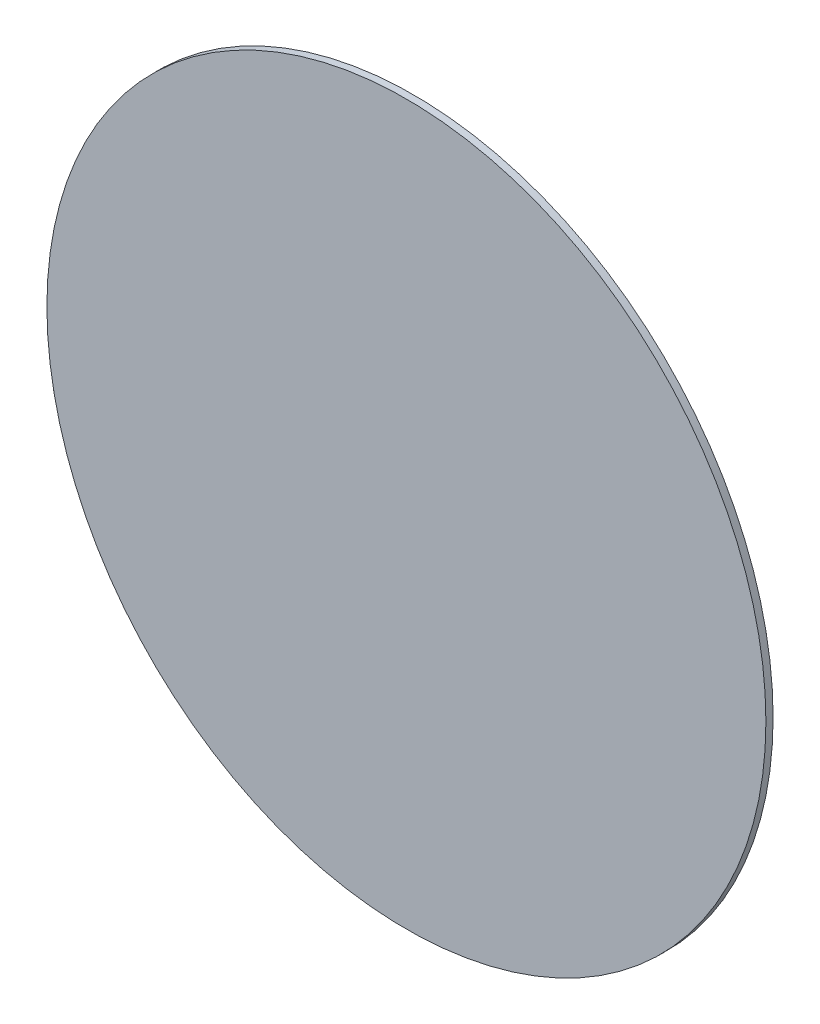
ISO-10303-21;
HEADER;
FILE_DESCRIPTION(('STEP AP214'),'2;1');
FILE_NAME('part.step','',(''),(''),'','','');
FILE_SCHEMA(('AUTOMOTIVE_DESIGN { 1 0 10303 214 1 1 1 1 }'));
ENDSEC;
DATA;
#1=APPLICATION_CONTEXT('core data for automotive mechanical design processes');
#2=APPLICATION_PROTOCOL_DEFINITION('international standard','automotive_design',2000,#1);
#3=PRODUCT_CONTEXT('',#1,'mechanical');
#4=PRODUCT('Part','Part','',(#3));
#5=PRODUCT_RELATED_PRODUCT_CATEGORY('part','',(#4));
#6=PRODUCT_DEFINITION_FORMATION('','',#4);
#7=PRODUCT_DEFINITION_CONTEXT('part definition',#1,'design');
#8=PRODUCT_DEFINITION('design','',#6,#7);
#9=PRODUCT_DEFINITION_SHAPE('','',#8);
#10=(LENGTH_UNIT() NAMED_UNIT(*) SI_UNIT(.MILLI.,.METRE.));
#11=(NAMED_UNIT(*) PLANE_ANGLE_UNIT() SI_UNIT($,.RADIAN.));
#12=(NAMED_UNIT(*) SI_UNIT($,.STERADIAN.) SOLID_ANGLE_UNIT());
#13=UNCERTAINTY_MEASURE_WITH_UNIT(LENGTH_MEASURE(1.E-05),#10,'distance_accuracy_value','');
#14=(GEOMETRIC_REPRESENTATION_CONTEXT(3) GLOBAL_UNCERTAINTY_ASSIGNED_CONTEXT((#13)) GLOBAL_UNIT_ASSIGNED_CONTEXT((#10,
#11,#12)) REPRESENTATION_CONTEXT('',''));
#15=CARTESIAN_POINT('',(0.,0.,0.));
#16=DIRECTION('',(0.,0.,1.));
#17=DIRECTION('',(1.,0.,0.));
#18=AXIS2_PLACEMENT_3D('',#15,#16,#17);
#19=CARTESIAN_POINT('',(0.,0.,1.));
#20=DIRECTION('',(0.,0.,-1.));
#21=DIRECTION('',(-1.,0.,0.));
#22=AXIS2_PLACEMENT_3D('',#19,#20,#21);
#23=CYLINDRICAL_SURFACE('',#22,50.);
#24=CARTESIAN_POINT('',(0.,0.,1.));
#25=DIRECTION('',(0.,0.,1.));
#26=DIRECTION('',(1.,0.,0.));
#27=AXIS2_PLACEMENT_3D('',#24,#25,#26);
#28=CIRCLE('',#27,50.);
#29=CARTESIAN_POINT('',(50.,0.,1.));
#30=VERTEX_POINT('',#29);
#31=EDGE_CURVE('E10',#30,#30,#28,.T.);
#32=ORIENTED_EDGE('',*,*,#31,.F.);
#33=EDGE_LOOP('',(#32));
#34=FACE_BOUND('',#33,.T.);
#35=CARTESIAN_POINT('',(0.,0.,0.));
#36=DIRECTION('',(0.,0.,1.));
#37=DIRECTION('',(1.,0.,0.));
#38=AXIS2_PLACEMENT_3D('',#35,#36,#37);
#39=CIRCLE('',#38,50.);
#40=CARTESIAN_POINT('',(50.,0.,0.));
#41=VERTEX_POINT('',#40);
#42=EDGE_CURVE('E40',#41,#41,#39,.T.);
#43=ORIENTED_EDGE('',*,*,#42,.T.);
#44=EDGE_LOOP('',(#43));
#45=FACE_BOUND('',#44,.T.);
#46=ADVANCED_FACE('F37',(#34,#45),#23,.T.);
#47=CARTESIAN_POINT('',(0.,0.,1.));
#48=DIRECTION('',(0.,0.,1.));
#49=DIRECTION('',(1.,0.,0.));
#50=AXIS2_PLACEMENT_3D('',#47,#48,#49);
#51=PLANE('',#50);
#52=ORIENTED_EDGE('',*,*,#31,.T.);
#53=EDGE_LOOP('',(#52));
#54=FACE_BOUND('',#53,.T.);
#55=ADVANCED_FACE('F52',(#54),#51,.T.);
#56=CARTESIAN_POINT('',(0.,0.,0.));
#57=DIRECTION('',(0.,0.,1.));
#58=DIRECTION('',(1.,0.,0.));
#59=AXIS2_PLACEMENT_3D('',#56,#57,#58);
#60=PLANE('',#59);
#61=ORIENTED_EDGE('',*,*,#42,.F.);
#62=EDGE_LOOP('',(#61));
#63=FACE_BOUND('',#62,.T.);
#64=ADVANCED_FACE('F50',(#63),#60,.F.);
#65=CLOSED_SHELL('',(#46,#55,#64));
#66=MANIFOLD_SOLID_BREP('B2',#65);
#67=ADVANCED_BREP_SHAPE_REPRESENTATION('',(#18,#66),#14);
#68=SHAPE_DEFINITION_REPRESENTATION(#9,#67);
ENDSEC;
END-ISO-10303-21;
